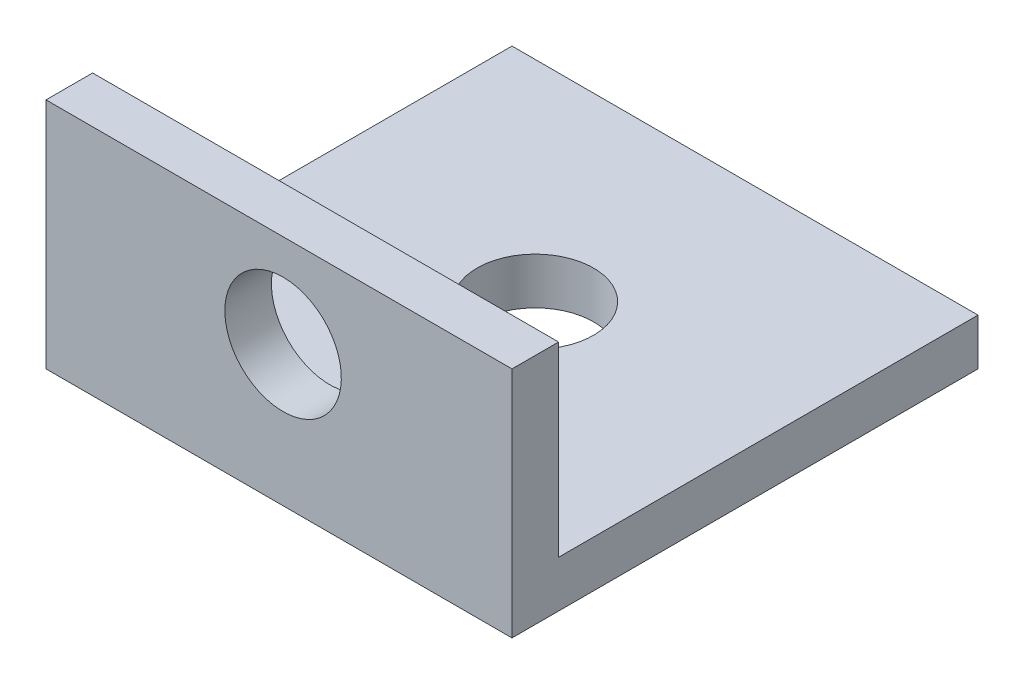
ISO-10303-21;
HEADER;
FILE_DESCRIPTION(('STEP AP214'),'2;1');
FILE_NAME('part.step','',(''),(''),'','','');
FILE_SCHEMA(('AUTOMOTIVE_DESIGN { 1 0 10303 214 1 1 1 1 }'));
ENDSEC;
DATA;
#1=APPLICATION_CONTEXT('core data for automotive mechanical design processes');
#2=APPLICATION_PROTOCOL_DEFINITION('international standard','automotive_design',2000,#1);
#3=PRODUCT_CONTEXT('',#1,'mechanical');
#4=PRODUCT('Part','Part','',(#3));
#5=PRODUCT_RELATED_PRODUCT_CATEGORY('part','',(#4));
#6=PRODUCT_DEFINITION_FORMATION('','',#4);
#7=PRODUCT_DEFINITION_CONTEXT('part definition',#1,'design');
#8=PRODUCT_DEFINITION('design','',#6,#7);
#9=PRODUCT_DEFINITION_SHAPE('','',#8);
#10=(LENGTH_UNIT() NAMED_UNIT(*) SI_UNIT(.MILLI.,.METRE.));
#11=(NAMED_UNIT(*) PLANE_ANGLE_UNIT() SI_UNIT($,.RADIAN.));
#12=(NAMED_UNIT(*) SI_UNIT($,.STERADIAN.) SOLID_ANGLE_UNIT());
#13=UNCERTAINTY_MEASURE_WITH_UNIT(LENGTH_MEASURE(1.E-05),#10,'distance_accuracy_value','');
#14=(GEOMETRIC_REPRESENTATION_CONTEXT(3) GLOBAL_UNCERTAINTY_ASSIGNED_CONTEXT((#13)) GLOBAL_UNIT_ASSIGNED_CONTEXT((#10,
#11,#12)) REPRESENTATION_CONTEXT('',''));
#15=CARTESIAN_POINT('',(0.,0.,0.));
#16=DIRECTION('',(0.,0.,1.));
#17=DIRECTION('',(1.,0.,0.));
#18=AXIS2_PLACEMENT_3D('',#15,#16,#17);
#19=CARTESIAN_POINT('',(20.,10.,-2.));
#20=DIRECTION('',(0.,-1.,0.));
#21=DIRECTION('',(0.,0.,-1.));
#22=AXIS2_PLACEMENT_3D('',#19,#20,#21);
#23=PLANE('',#22);
#24=DIRECTION('',(0.,0.,1.));
#25=VECTOR('',#24,1.);
#26=CARTESIAN_POINT('',(0.,10.,-2.));
#27=LINE('',#26,#25);
#28=CARTESIAN_POINT('',(0.,10.,-2.));
#29=VERTEX_POINT('',#28);
#30=CARTESIAN_POINT('',(0.,10.,0.));
#31=VERTEX_POINT('',#30);
#32=EDGE_CURVE('E122',#29,#31,#27,.T.);
#33=ORIENTED_EDGE('',*,*,#32,.T.);
#34=DIRECTION('',(-1.,0.,0.));
#35=VECTOR('',#34,1.);
#36=CARTESIAN_POINT('',(20.,10.,0.));
#37=LINE('',#36,#35);
#38=CARTESIAN_POINT('',(20.,10.,0.));
#39=VERTEX_POINT('',#38);
#40=EDGE_CURVE('E11',#39,#31,#37,.T.);
#41=ORIENTED_EDGE('',*,*,#40,.F.);
#42=DIRECTION('',(0.,0.,1.));
#43=VECTOR('',#42,1.);
#44=CARTESIAN_POINT('',(20.,10.,-2.));
#45=LINE('',#44,#43);
#46=CARTESIAN_POINT('',(20.,10.,-2.));
#47=VERTEX_POINT('',#46);
#48=EDGE_CURVE('E133',#47,#39,#45,.T.);
#49=ORIENTED_EDGE('',*,*,#48,.F.);
#50=DIRECTION('',(-1.,0.,0.));
#51=VECTOR('',#50,1.);
#52=CARTESIAN_POINT('',(20.,10.,-2.));
#53=LINE('',#52,#51);
#54=EDGE_CURVE('E118',#47,#29,#53,.T.);
#55=ORIENTED_EDGE('',*,*,#54,.T.);
#56=EDGE_LOOP('',(#33,#41,#49,#55));
#57=FACE_BOUND('',#56,.T.);
#58=ADVANCED_FACE('F38',(#57),#23,.F.);
#59=CARTESIAN_POINT('',(20.,10.,0.));
#60=DIRECTION('',(0.,0.,-1.));
#61=DIRECTION('',(-1.,0.,0.));
#62=AXIS2_PLACEMENT_3D('',#59,#60,#61);
#63=PLANE('',#62);
#64=CARTESIAN_POINT('',(10.1748684468532,6.,0.));
#65=DIRECTION('',(0.,0.,-1.));
#66=DIRECTION('',(0.,1.,0.));
#67=AXIS2_PLACEMENT_3D('',#64,#65,#66);
#68=CIRCLE('',#67,2.5);
#69=CARTESIAN_POINT('',(10.1748684468532,8.5,0.));
#70=VERTEX_POINT('',#69);
#71=EDGE_CURVE('E126',#70,#70,#68,.T.);
#72=ORIENTED_EDGE('',*,*,#71,.T.);
#73=EDGE_LOOP('',(#72));
#74=FACE_BOUND('',#73,.T.);
#75=DIRECTION('',(0.,-1.,0.));
#76=VECTOR('',#75,1.);
#77=CARTESIAN_POINT('',(0.,10.,0.));
#78=LINE('',#77,#76);
#79=CARTESIAN_POINT('',(0.,0.,0.));
#80=VERTEX_POINT('',#79);
#81=EDGE_CURVE('E125',#31,#80,#78,.T.);
#82=ORIENTED_EDGE('',*,*,#81,.T.);
#83=DIRECTION('',(-1.,0.,0.));
#84=VECTOR('',#83,1.);
#85=CARTESIAN_POINT('',(20.,0.,0.));
#86=LINE('',#85,#84);
#87=CARTESIAN_POINT('',(20.,0.,0.));
#88=VERTEX_POINT('',#87);
#89=EDGE_CURVE('E46',#88,#80,#86,.T.);
#90=ORIENTED_EDGE('',*,*,#89,.F.);
#91=DIRECTION('',(0.,-1.,0.));
#92=VECTOR('',#91,1.);
#93=CARTESIAN_POINT('',(20.,10.,0.));
#94=LINE('',#93,#92);
#95=EDGE_CURVE('E91',#39,#88,#94,.T.);
#96=ORIENTED_EDGE('',*,*,#95,.F.);
#97=ORIENTED_EDGE('',*,*,#40,.T.);
#98=EDGE_LOOP('',(#82,#90,#96,#97));
#99=FACE_BOUND('',#98,.T.);
#100=ADVANCED_FACE('F160',(#74,#99),#63,.F.);
#101=CARTESIAN_POINT('',(20.,0.,0.));
#102=DIRECTION('',(0.,1.,0.));
#103=DIRECTION('',(0.,0.,1.));
#104=AXIS2_PLACEMENT_3D('',#101,#102,#103);
#105=PLANE('',#104);
#106=CARTESIAN_POINT('',(10.,0.,-11.));
#107=DIRECTION('',(0.,1.,0.));
#108=DIRECTION('',(0.,0.,1.));
#109=AXIS2_PLACEMENT_3D('',#106,#107,#108);
#110=CIRCLE('',#109,2.5);
#111=CARTESIAN_POINT('',(10.,0.,-8.5));
#112=VERTEX_POINT('',#111);
#113=EDGE_CURVE('E260',#112,#112,#110,.T.);
#114=ORIENTED_EDGE('',*,*,#113,.T.);
#115=EDGE_LOOP('',(#114));
#116=FACE_BOUND('',#115,.T.);
#117=DIRECTION('',(0.,0.,-1.));
#118=VECTOR('',#117,1.);
#119=CARTESIAN_POINT('',(0.,0.,0.));
#120=LINE('',#119,#118);
#121=CARTESIAN_POINT('',(0.,0.,-20.));
#122=VERTEX_POINT('',#121);
#123=EDGE_CURVE('E128',#80,#122,#120,.T.);
#124=ORIENTED_EDGE('',*,*,#123,.T.);
#125=DIRECTION('',(-1.,0.,0.));
#126=VECTOR('',#125,1.);
#127=CARTESIAN_POINT('',(20.,0.,-20.));
#128=LINE('',#127,#126);
#129=CARTESIAN_POINT('',(20.,0.,-20.));
#130=VERTEX_POINT('',#129);
#131=EDGE_CURVE('E113',#130,#122,#128,.T.);
#132=ORIENTED_EDGE('',*,*,#131,.F.);
#133=DIRECTION('',(0.,0.,-1.));
#134=VECTOR('',#133,1.);
#135=CARTESIAN_POINT('',(20.,0.,0.));
#136=LINE('',#135,#134);
#137=EDGE_CURVE('E104',#88,#130,#136,.T.);
#138=ORIENTED_EDGE('',*,*,#137,.F.);
#139=ORIENTED_EDGE('',*,*,#89,.T.);
#140=EDGE_LOOP('',(#124,#132,#138,#139));
#141=FACE_BOUND('',#140,.T.);
#142=ADVANCED_FACE('F139',(#116,#141),#105,.F.);
#143=CARTESIAN_POINT('',(20.,0.,-20.));
#144=DIRECTION('',(0.,0.,1.));
#145=DIRECTION('',(1.,0.,0.));
#146=AXIS2_PLACEMENT_3D('',#143,#144,#145);
#147=PLANE('',#146);
#148=DIRECTION('',(0.,1.,0.));
#149=VECTOR('',#148,1.);
#150=CARTESIAN_POINT('',(0.,0.,-20.));
#151=LINE('',#150,#149);
#152=CARTESIAN_POINT('',(0.,2.,-20.));
#153=VERTEX_POINT('',#152);
#154=EDGE_CURVE('E112',#122,#153,#151,.T.);
#155=ORIENTED_EDGE('',*,*,#154,.T.);
#156=DIRECTION('',(-1.,0.,0.));
#157=VECTOR('',#156,1.);
#158=CARTESIAN_POINT('',(20.,2.,-20.));
#159=LINE('',#158,#157);
#160=CARTESIAN_POINT('',(20.,2.,-20.));
#161=VERTEX_POINT('',#160);
#162=EDGE_CURVE('E109',#161,#153,#159,.T.);
#163=ORIENTED_EDGE('',*,*,#162,.F.);
#164=DIRECTION('',(0.,1.,0.));
#165=VECTOR('',#164,1.);
#166=CARTESIAN_POINT('',(20.,0.,-20.));
#167=LINE('',#166,#165);
#168=EDGE_CURVE('E98',#130,#161,#167,.T.);
#169=ORIENTED_EDGE('',*,*,#168,.F.);
#170=ORIENTED_EDGE('',*,*,#131,.T.);
#171=EDGE_LOOP('',(#155,#163,#169,#170));
#172=FACE_BOUND('',#171,.T.);
#173=ADVANCED_FACE('F110',(#172),#147,.F.);
#174=CARTESIAN_POINT('',(20.,2.,-20.));
#175=DIRECTION('',(0.,-1.,0.));
#176=DIRECTION('',(0.,0.,-1.));
#177=AXIS2_PLACEMENT_3D('',#174,#175,#176);
#178=PLANE('',#177);
#179=CARTESIAN_POINT('',(10.,2.,-11.));
#180=DIRECTION('',(0.,1.,0.));
#181=DIRECTION('',(0.,0.,1.));
#182=AXIS2_PLACEMENT_3D('',#179,#180,#181);
#183=CIRCLE('',#182,2.5);
#184=CARTESIAN_POINT('',(10.,2.,-8.5));
#185=VERTEX_POINT('',#184);
#186=EDGE_CURVE('E264',#185,#185,#183,.T.);
#187=ORIENTED_EDGE('',*,*,#186,.F.);
#188=EDGE_LOOP('',(#187));
#189=FACE_BOUND('',#188,.T.);
#190=DIRECTION('',(0.,0.,1.));
#191=VECTOR('',#190,1.);
#192=CARTESIAN_POINT('',(0.,2.,-20.));
#193=LINE('',#192,#191);
#194=CARTESIAN_POINT('',(0.,2.,-2.));
#195=VERTEX_POINT('',#194);
#196=EDGE_CURVE('E77',#153,#195,#193,.T.);
#197=ORIENTED_EDGE('',*,*,#196,.T.);
#198=DIRECTION('',(-1.,0.,0.));
#199=VECTOR('',#198,1.);
#200=CARTESIAN_POINT('',(20.,2.,-2.));
#201=LINE('',#200,#199);
#202=CARTESIAN_POINT('',(20.,2.,-2.));
#203=VERTEX_POINT('',#202);
#204=EDGE_CURVE('E114',#203,#195,#201,.T.);
#205=ORIENTED_EDGE('',*,*,#204,.F.);
#206=DIRECTION('',(0.,0.,1.));
#207=VECTOR('',#206,1.);
#208=CARTESIAN_POINT('',(20.,2.,-20.));
#209=LINE('',#208,#207);
#210=EDGE_CURVE('E102',#161,#203,#209,.T.);
#211=ORIENTED_EDGE('',*,*,#210,.F.);
#212=ORIENTED_EDGE('',*,*,#162,.T.);
#213=EDGE_LOOP('',(#197,#205,#211,#212));
#214=FACE_BOUND('',#213,.T.);
#215=ADVANCED_FACE('F116',(#189,#214),#178,.F.);
#216=CARTESIAN_POINT('',(20.,2.,-2.));
#217=DIRECTION('',(0.,0.,1.));
#218=DIRECTION('',(0.,-1.,0.));
#219=AXIS2_PLACEMENT_3D('',#216,#217,#218);
#220=PLANE('',#219);
#221=CARTESIAN_POINT('',(10.1748684468532,6.,-2.));
#222=DIRECTION('',(0.,0.,-1.));
#223=DIRECTION('',(0.,1.,0.));
#224=AXIS2_PLACEMENT_3D('',#221,#222,#223);
#225=CIRCLE('',#224,2.5);
#226=CARTESIAN_POINT('',(10.1748684468532,8.5,-2.));
#227=VERTEX_POINT('',#226);
#228=EDGE_CURVE('E259',#227,#227,#225,.T.);
#229=ORIENTED_EDGE('',*,*,#228,.F.);
#230=EDGE_LOOP('',(#229));
#231=FACE_BOUND('',#230,.T.);
#232=DIRECTION('',(0.,1.,0.));
#233=VECTOR('',#232,1.);
#234=CARTESIAN_POINT('',(0.,2.,-2.));
#235=LINE('',#234,#233);
#236=EDGE_CURVE('E83',#195,#29,#235,.T.);
#237=ORIENTED_EDGE('',*,*,#236,.T.);
#238=ORIENTED_EDGE('',*,*,#54,.F.);
#239=DIRECTION('',(0.,1.,0.));
#240=VECTOR('',#239,1.);
#241=CARTESIAN_POINT('',(20.,2.,-2.));
#242=LINE('',#241,#240);
#243=EDGE_CURVE('E54',#203,#47,#242,.T.);
#244=ORIENTED_EDGE('',*,*,#243,.F.);
#245=ORIENTED_EDGE('',*,*,#204,.T.);
#246=EDGE_LOOP('',(#237,#238,#244,#245));
#247=FACE_BOUND('',#246,.T.);
#248=ADVANCED_FACE('F146',(#231,#247),#220,.F.);
#249=CARTESIAN_POINT('',(20.,0.,0.));
#250=DIRECTION('',(1.,0.,0.));
#251=DIRECTION('',(0.,0.,-1.));
#252=AXIS2_PLACEMENT_3D('',#249,#250,#251);
#253=PLANE('',#252);
#254=ORIENTED_EDGE('',*,*,#48,.T.);
#255=ORIENTED_EDGE('',*,*,#95,.T.);
#256=ORIENTED_EDGE('',*,*,#137,.T.);
#257=ORIENTED_EDGE('',*,*,#168,.T.);
#258=ORIENTED_EDGE('',*,*,#210,.T.);
#259=ORIENTED_EDGE('',*,*,#243,.T.);
#260=EDGE_LOOP('',(#254,#255,#256,#257,#258,#259));
#261=FACE_BOUND('',#260,.T.);
#262=ADVANCED_FACE('F100',(#261),#253,.T.);
#263=CARTESIAN_POINT('',(0.,0.,0.));
#264=DIRECTION('',(1.,0.,0.));
#265=DIRECTION('',(0.,0.,-1.));
#266=AXIS2_PLACEMENT_3D('',#263,#264,#265);
#267=PLANE('',#266);
#268=ORIENTED_EDGE('',*,*,#32,.F.);
#269=ORIENTED_EDGE('',*,*,#236,.F.);
#270=ORIENTED_EDGE('',*,*,#196,.F.);
#271=ORIENTED_EDGE('',*,*,#154,.F.);
#272=ORIENTED_EDGE('',*,*,#123,.F.);
#273=ORIENTED_EDGE('',*,*,#81,.F.);
#274=EDGE_LOOP('',(#268,#269,#270,#271,#272,#273));
#275=FACE_BOUND('',#274,.T.);
#276=ADVANCED_FACE('F142',(#275),#267,.F.);
#277=CARTESIAN_POINT('',(10.1748684468532,6.,0.));
#278=DIRECTION('',(0.,0.,-1.));
#279=DIRECTION('',(0.,1.,0.));
#280=AXIS2_PLACEMENT_3D('',#277,#278,#279);
#281=CYLINDRICAL_SURFACE('',#280,2.5);
#282=ORIENTED_EDGE('',*,*,#71,.F.);
#283=EDGE_LOOP('',(#282));
#284=FACE_BOUND('',#283,.T.);
#285=ORIENTED_EDGE('',*,*,#228,.T.);
#286=EDGE_LOOP('',(#285));
#287=FACE_BOUND('',#286,.T.);
#288=ADVANCED_FACE('F196',(#284,#287),#281,.F.);
#289=CARTESIAN_POINT('',(10.,0.,-11.));
#290=DIRECTION('',(0.,1.,0.));
#291=DIRECTION('',(0.,0.,1.));
#292=AXIS2_PLACEMENT_3D('',#289,#290,#291);
#293=CYLINDRICAL_SURFACE('',#292,2.5);
#294=ORIENTED_EDGE('',*,*,#113,.F.);
#295=EDGE_LOOP('',(#294));
#296=FACE_BOUND('',#295,.T.);
#297=ORIENTED_EDGE('',*,*,#186,.T.);
#298=EDGE_LOOP('',(#297));
#299=FACE_BOUND('',#298,.T.);
#300=ADVANCED_FACE('F192',(#296,#299),#293,.F.);
#301=CLOSED_SHELL('',(#58,#100,#142,#173,#215,#248,#262,#276,#288,#300));
#302=MANIFOLD_SOLID_BREP('B2',#301);
#303=ADVANCED_BREP_SHAPE_REPRESENTATION('',(#18,#302),#14);
#304=SHAPE_DEFINITION_REPRESENTATION(#9,#303);
ENDSEC;
END-ISO-10303-21;
